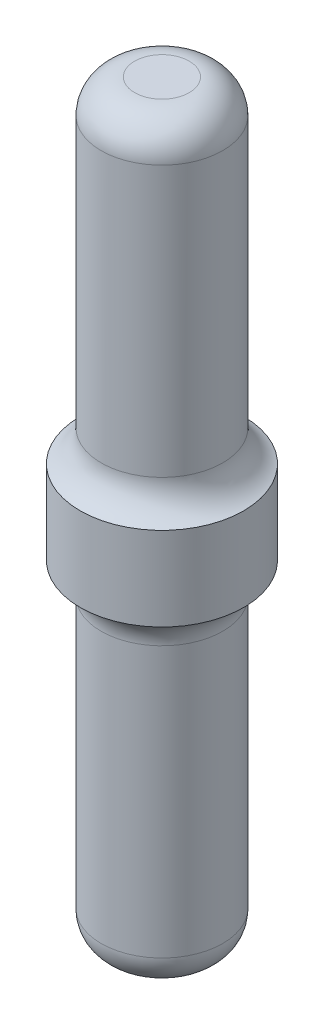
ISO-10303-21;
HEADER;
FILE_DESCRIPTION(('STEP AP214'),'2;1');
FILE_NAME('part.step','',(''),(''),'','','');
FILE_SCHEMA(('AUTOMOTIVE_DESIGN { 1 0 10303 214 1 1 1 1 }'));
ENDSEC;
DATA;
#1=APPLICATION_CONTEXT('core data for automotive mechanical design processes');
#2=APPLICATION_PROTOCOL_DEFINITION('international standard','automotive_design',2000,#1);
#3=PRODUCT_CONTEXT('',#1,'mechanical');
#4=PRODUCT('Part','Part','',(#3));
#5=PRODUCT_RELATED_PRODUCT_CATEGORY('part','',(#4));
#6=PRODUCT_DEFINITION_FORMATION('','',#4);
#7=PRODUCT_DEFINITION_CONTEXT('part definition',#1,'design');
#8=PRODUCT_DEFINITION('design','',#6,#7);
#9=PRODUCT_DEFINITION_SHAPE('','',#8);
#10=(LENGTH_UNIT() NAMED_UNIT(*) SI_UNIT(.MILLI.,.METRE.));
#11=(NAMED_UNIT(*) PLANE_ANGLE_UNIT() SI_UNIT($,.RADIAN.));
#12=(NAMED_UNIT(*) SI_UNIT($,.STERADIAN.) SOLID_ANGLE_UNIT());
#13=UNCERTAINTY_MEASURE_WITH_UNIT(LENGTH_MEASURE(1.E-05),#10,'distance_accuracy_value','');
#14=(GEOMETRIC_REPRESENTATION_CONTEXT(3) GLOBAL_UNCERTAINTY_ASSIGNED_CONTEXT((#13)) GLOBAL_UNIT_ASSIGNED_CONTEXT((#10,
#11,#12)) REPRESENTATION_CONTEXT('',''));
#15=CARTESIAN_POINT('',(0.,0.,0.));
#16=DIRECTION('',(0.,0.,1.));
#17=DIRECTION('',(1.,0.,0.));
#18=AXIS2_PLACEMENT_3D('',#15,#16,#17);
#19=CARTESIAN_POINT('',(0.,2.5,0.));
#20=DIRECTION('',(0.,-1.,0.));
#21=DIRECTION('',(0.,0.,-1.));
#22=AXIS2_PLACEMENT_3D('',#19,#20,#21);
#23=CYLINDRICAL_SURFACE('',#22,2.44);
#24=CARTESIAN_POINT('',(0.,2.5,0.));
#25=DIRECTION('',(0.,1.,0.));
#26=DIRECTION('',(0.,0.,1.));
#27=AXIS2_PLACEMENT_3D('',#24,#25,#26);
#28=CIRCLE('',#27,2.44);
#29=CARTESIAN_POINT('',(0.,2.5,2.44));
#30=VERTEX_POINT('',#29);
#31=EDGE_CURVE('E69',#30,#30,#28,.T.);
#32=ORIENTED_EDGE('',*,*,#31,.F.);
#33=EDGE_LOOP('',(#32));
#34=FACE_BOUND('',#33,.T.);
#35=CARTESIAN_POINT('',(0.,0.,0.));
#36=DIRECTION('',(0.,1.,0.));
#37=DIRECTION('',(0.,0.,1.));
#38=AXIS2_PLACEMENT_3D('',#35,#36,#37);
#39=CIRCLE('',#38,2.44);
#40=CARTESIAN_POINT('',(0.,0.,2.44));
#41=VERTEX_POINT('',#40);
#42=EDGE_CURVE('E70',#41,#41,#39,.T.);
#43=ORIENTED_EDGE('',*,*,#42,.T.);
#44=EDGE_LOOP('',(#43));
#45=FACE_BOUND('',#44,.T.);
#46=ADVANCED_FACE('F43',(#34,#45),#23,.T.);
#47=CARTESIAN_POINT('',(0.,12.5,0.));
#48=DIRECTION('',(0.,-1.,0.));
#49=DIRECTION('',(0.,0.,-1.));
#50=AXIS2_PLACEMENT_3D('',#47,#48,#49);
#51=CYLINDRICAL_SURFACE('',#50,1.815);
#52=CARTESIAN_POINT('',(0.,11.5,0.));
#53=DIRECTION('',(0.,1.,0.));
#54=DIRECTION('',(0.,0.,1.));
#55=AXIS2_PLACEMENT_3D('',#52,#53,#54);
#56=CIRCLE('',#55,1.815);
#57=CARTESIAN_POINT('',(0.,11.5,1.815));
#58=VERTEX_POINT('',#57);
#59=EDGE_CURVE('E54',#58,#58,#56,.F.);
#60=ORIENTED_EDGE('',*,*,#59,.T.);
#61=EDGE_LOOP('',(#60));
#62=FACE_BOUND('',#61,.T.);
#63=CARTESIAN_POINT('',(0.,3.42702481088696,0.));
#64=DIRECTION('',(0.,-1.,0.));
#65=DIRECTION('',(0.,0.,-1.));
#66=AXIS2_PLACEMENT_3D('',#63,#64,#65);
#67=CIRCLE('',#66,1.815);
#68=CARTESIAN_POINT('',(0.,3.42702481088696,-1.815));
#69=VERTEX_POINT('',#68);
#70=EDGE_CURVE('E63',#69,#69,#67,.F.);
#71=ORIENTED_EDGE('',*,*,#70,.T.);
#72=EDGE_LOOP('',(#71));
#73=FACE_BOUND('',#72,.T.);
#74=ADVANCED_FACE('F81',(#62,#73),#51,.T.);
#75=CARTESIAN_POINT('',(0.,12.5,0.));
#76=DIRECTION('',(0.,1.,0.));
#77=DIRECTION('',(0.,0.,1.));
#78=AXIS2_PLACEMENT_3D('',#75,#76,#77);
#79=PLANE('',#78);
#80=CARTESIAN_POINT('',(0.,12.5,0.));
#81=DIRECTION('',(0.,1.,0.));
#82=DIRECTION('',(0.,0.,1.));
#83=AXIS2_PLACEMENT_3D('',#80,#81,#82);
#84=CIRCLE('',#83,0.815);
#85=CARTESIAN_POINT('',(0.,12.5,0.815));
#86=VERTEX_POINT('',#85);
#87=EDGE_CURVE('E58',#86,#86,#84,.T.);
#88=ORIENTED_EDGE('',*,*,#87,.T.);
#89=EDGE_LOOP('',(#88));
#90=FACE_BOUND('',#89,.T.);
#91=ADVANCED_FACE('F94',(#90),#79,.T.);
#92=CARTESIAN_POINT('',(0.,-10.,0.));
#93=DIRECTION('',(0.,1.,0.));
#94=DIRECTION('',(0.,0.,1.));
#95=AXIS2_PLACEMENT_3D('',#92,#93,#94);
#96=CYLINDRICAL_SURFACE('',#95,1.815);
#97=CARTESIAN_POINT('',(0.,-9.,0.));
#98=DIRECTION('',(0.,-1.,0.));
#99=DIRECTION('',(0.,0.,-1.));
#100=AXIS2_PLACEMENT_3D('',#97,#98,#99);
#101=CIRCLE('',#100,1.815);
#102=CARTESIAN_POINT('',(0.,-9.,-1.815));
#103=VERTEX_POINT('',#102);
#104=EDGE_CURVE('E10',#103,#103,#101,.F.);
#105=ORIENTED_EDGE('',*,*,#104,.T.);
#106=EDGE_LOOP('',(#105));
#107=FACE_BOUND('',#106,.T.);
#108=CARTESIAN_POINT('',(0.,-0.927024810886959,0.));
#109=DIRECTION('',(0.,1.,0.));
#110=DIRECTION('',(0.,0.,1.));
#111=AXIS2_PLACEMENT_3D('',#108,#109,#110);
#112=CIRCLE('',#111,1.815);
#113=CARTESIAN_POINT('',(0.,-0.927024810886959,1.815));
#114=VERTEX_POINT('',#113);
#115=EDGE_CURVE('E66',#114,#114,#112,.F.);
#116=ORIENTED_EDGE('',*,*,#115,.T.);
#117=EDGE_LOOP('',(#116));
#118=FACE_BOUND('',#117,.T.);
#119=ADVANCED_FACE('F92',(#107,#118),#96,.T.);
#120=CARTESIAN_POINT('',(0.,-10.,0.));
#121=DIRECTION('',(0.,-1.,0.));
#122=DIRECTION('',(0.,0.,-1.));
#123=AXIS2_PLACEMENT_3D('',#120,#121,#122);
#124=PLANE('',#123);
#125=CARTESIAN_POINT('',(0.,-10.,0.));
#126=DIRECTION('',(0.,-1.,0.));
#127=DIRECTION('',(0.,0.,-1.));
#128=AXIS2_PLACEMENT_3D('',#125,#126,#127);
#129=CIRCLE('',#128,0.815);
#130=CARTESIAN_POINT('',(0.,-10.,-0.815));
#131=VERTEX_POINT('',#130);
#132=EDGE_CURVE('E50',#131,#131,#129,.T.);
#133=ORIENTED_EDGE('',*,*,#132,.T.);
#134=EDGE_LOOP('',(#133));
#135=FACE_BOUND('',#134,.T.);
#136=ADVANCED_FACE('F88',(#135),#124,.T.);
#137=CARTESIAN_POINT('',(0.,-0.927024810886958,0.));
#138=DIRECTION('',(0.,1.,0.));
#139=DIRECTION('',(0.,0.,1.));
#140=AXIS2_PLACEMENT_3D('',#137,#138,#139);
#141=TOROIDAL_SURFACE('',#140,2.815,1.);
#142=ORIENTED_EDGE('',*,*,#42,.F.);
#143=EDGE_LOOP('',(#142));
#144=FACE_BOUND('',#143,.T.);
#145=ORIENTED_EDGE('',*,*,#115,.F.);
#146=EDGE_LOOP('',(#145));
#147=FACE_BOUND('',#146,.T.);
#148=ADVANCED_FACE('F85',(#144,#147),#141,.F.);
#149=CARTESIAN_POINT('',(0.,3.42702481088696,0.));
#150=DIRECTION('',(0.,-1.,0.));
#151=DIRECTION('',(0.,0.,-1.));
#152=AXIS2_PLACEMENT_3D('',#149,#150,#151);
#153=TOROIDAL_SURFACE('',#152,2.815,1.);
#154=ORIENTED_EDGE('',*,*,#31,.T.);
#155=EDGE_LOOP('',(#154));
#156=FACE_BOUND('',#155,.T.);
#157=ORIENTED_EDGE('',*,*,#70,.F.);
#158=EDGE_LOOP('',(#157));
#159=FACE_BOUND('',#158,.T.);
#160=ADVANCED_FACE('F76',(#156,#159),#153,.F.);
#161=CARTESIAN_POINT('',(0.,11.5,0.));
#162=DIRECTION('',(0.,1.,0.));
#163=DIRECTION('',(0.,0.,1.));
#164=AXIS2_PLACEMENT_3D('',#161,#162,#163);
#165=DEGENERATE_TOROIDAL_SURFACE('',#164,0.815,1.,.T.);
#166=ORIENTED_EDGE('',*,*,#59,.F.);
#167=EDGE_LOOP('',(#166));
#168=FACE_BOUND('',#167,.T.);
#169=ORIENTED_EDGE('',*,*,#87,.F.);
#170=EDGE_LOOP('',(#169));
#171=FACE_BOUND('',#170,.T.);
#172=ADVANCED_FACE('F108',(#168,#171),#165,.T.);
#173=CARTESIAN_POINT('',(0.,-9.,0.));
#174=DIRECTION('',(0.,-1.,0.));
#175=DIRECTION('',(0.,0.,-1.));
#176=AXIS2_PLACEMENT_3D('',#173,#174,#175);
#177=DEGENERATE_TOROIDAL_SURFACE('',#176,0.815,1.,.T.);
#178=ORIENTED_EDGE('',*,*,#104,.F.);
#179=EDGE_LOOP('',(#178));
#180=FACE_BOUND('',#179,.T.);
#181=ORIENTED_EDGE('',*,*,#132,.F.);
#182=EDGE_LOOP('',(#181));
#183=FACE_BOUND('',#182,.T.);
#184=ADVANCED_FACE('F45',(#180,#183),#177,.T.);
#185=CLOSED_SHELL('',(#46,#74,#91,#119,#136,#148,#160,#172,#184));
#186=MANIFOLD_SOLID_BREP('B2',#185);
#187=ADVANCED_BREP_SHAPE_REPRESENTATION('',(#18,#186),#14);
#188=SHAPE_DEFINITION_REPRESENTATION(#9,#187);
ENDSEC;
END-ISO-10303-21;
